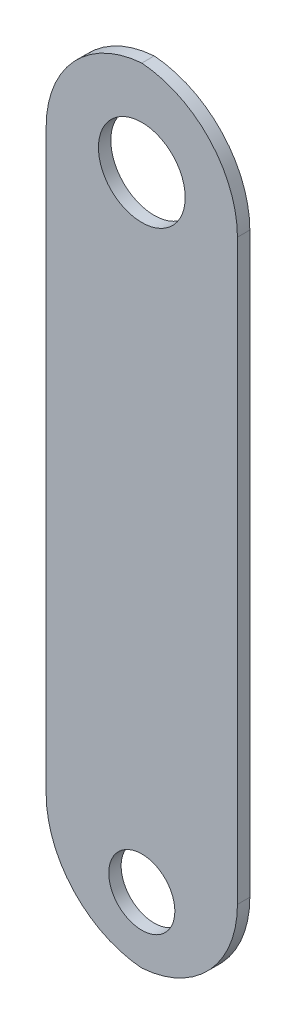
ISO-10303-21;
HEADER;
FILE_DESCRIPTION(('STEP AP214'),'2;1');
FILE_NAME('part.step','',(''),(''),'','','');
FILE_SCHEMA(('AUTOMOTIVE_DESIGN { 1 0 10303 214 1 1 1 1 }'));
ENDSEC;
DATA;
#1=APPLICATION_CONTEXT('core data for automotive mechanical design processes');
#2=APPLICATION_PROTOCOL_DEFINITION('international standard','automotive_design',2000,#1);
#3=PRODUCT_CONTEXT('',#1,'mechanical');
#4=PRODUCT('Part','Part','',(#3));
#5=PRODUCT_RELATED_PRODUCT_CATEGORY('part','',(#4));
#6=PRODUCT_DEFINITION_FORMATION('','',#4);
#7=PRODUCT_DEFINITION_CONTEXT('part definition',#1,'design');
#8=PRODUCT_DEFINITION('design','',#6,#7);
#9=PRODUCT_DEFINITION_SHAPE('','',#8);
#10=(LENGTH_UNIT() NAMED_UNIT(*) SI_UNIT(.MILLI.,.METRE.));
#11=(NAMED_UNIT(*) PLANE_ANGLE_UNIT() SI_UNIT($,.RADIAN.));
#12=(NAMED_UNIT(*) SI_UNIT($,.STERADIAN.) SOLID_ANGLE_UNIT());
#13=UNCERTAINTY_MEASURE_WITH_UNIT(LENGTH_MEASURE(1.E-05),#10,'distance_accuracy_value','');
#14=(GEOMETRIC_REPRESENTATION_CONTEXT(3) GLOBAL_UNCERTAINTY_ASSIGNED_CONTEXT((#13)) GLOBAL_UNIT_ASSIGNED_CONTEXT((#10,
#11,#12)) REPRESENTATION_CONTEXT('',''));
#15=CARTESIAN_POINT('',(0.,0.,0.));
#16=DIRECTION('',(0.,0.,1.));
#17=DIRECTION('',(1.,0.,0.));
#18=AXIS2_PLACEMENT_3D('',#15,#16,#17);
#19=CARTESIAN_POINT('',(0.,0.,3.));
#20=DIRECTION('',(0.,0.,1.));
#21=DIRECTION('',(1.,0.,0.));
#22=AXIS2_PLACEMENT_3D('',#19,#20,#21);
#23=PLANE('',#22);
#24=CARTESIAN_POINT('',(0.,71.93,3.));
#25=DIRECTION('',(0.,0.,1.));
#26=DIRECTION('',(1.,0.,0.));
#27=AXIS2_PLACEMENT_3D('',#24,#25,#26);
#28=CIRCLE('',#27,10.5);
#29=CARTESIAN_POINT('',(10.5,71.93,3.));
#30=VERTEX_POINT('',#29);
#31=EDGE_CURVE('E125',#30,#30,#28,.T.);
#32=ORIENTED_EDGE('',*,*,#31,.F.);
#33=EDGE_LOOP('',(#32));
#34=FACE_BOUND('',#33,.T.);
#35=CARTESIAN_POINT('',(1.85,-69.93,3.));
#36=DIRECTION('',(0.,0.,1.));
#37=DIRECTION('',(1.,0.,0.));
#38=AXIS2_PLACEMENT_3D('',#35,#36,#37);
#39=CIRCLE('',#38,25.);
#40=CARTESIAN_POINT('',(-23.15,-69.93,3.));
#41=VERTEX_POINT('',#40);
#42=CARTESIAN_POINT('',(0.,-94.8614560344958,3.));
#43=VERTEX_POINT('',#42);
#44=EDGE_CURVE('E58',#41,#43,#39,.T.);
#45=ORIENTED_EDGE('',*,*,#44,.T.);
#46=CARTESIAN_POINT('',(-1.85,-69.93,3.));
#47=DIRECTION('',(0.,0.,1.));
#48=DIRECTION('',(1.,0.,0.));
#49=AXIS2_PLACEMENT_3D('',#46,#47,#48);
#50=CIRCLE('',#49,25.);
#51=CARTESIAN_POINT('',(23.15,-69.93,3.));
#52=VERTEX_POINT('',#51);
#53=EDGE_CURVE('E138',#43,#52,#50,.T.);
#54=ORIENTED_EDGE('',*,*,#53,.T.);
#55=DIRECTION('',(0.,1.,0.));
#56=VECTOR('',#55,1.);
#57=CARTESIAN_POINT('',(23.15,-94.93,3.));
#58=LINE('',#57,#56);
#59=CARTESIAN_POINT('',(23.15,69.93,3.));
#60=VERTEX_POINT('',#59);
#61=EDGE_CURVE('E113',#52,#60,#58,.T.);
#62=ORIENTED_EDGE('',*,*,#61,.T.);
#63=CARTESIAN_POINT('',(-1.85000000000001,69.93,3.));
#64=DIRECTION('',(0.,0.,1.));
#65=DIRECTION('',(1.,0.,0.));
#66=AXIS2_PLACEMENT_3D('',#63,#64,#65);
#67=CIRCLE('',#66,25.);
#68=CARTESIAN_POINT('',(0.,94.8614560344959,3.));
#69=VERTEX_POINT('',#68);
#70=EDGE_CURVE('E65',#60,#69,#67,.T.);
#71=ORIENTED_EDGE('',*,*,#70,.T.);
#72=CARTESIAN_POINT('',(1.85,69.93,3.));
#73=DIRECTION('',(0.,0.,1.));
#74=DIRECTION('',(1.,0.,0.));
#75=AXIS2_PLACEMENT_3D('',#72,#73,#74);
#76=CIRCLE('',#75,25.);
#77=CARTESIAN_POINT('',(-23.15,69.93,3.));
#78=VERTEX_POINT('',#77);
#79=EDGE_CURVE('E135',#69,#78,#76,.T.);
#80=ORIENTED_EDGE('',*,*,#79,.T.);
#81=DIRECTION('',(0.,-1.,0.));
#82=VECTOR('',#81,1.);
#83=CARTESIAN_POINT('',(-23.15,-94.93,3.));
#84=LINE('',#83,#82);
#85=EDGE_CURVE('E120',#78,#41,#84,.T.);
#86=ORIENTED_EDGE('',*,*,#85,.T.);
#87=EDGE_LOOP('',(#45,#54,#62,#71,#80,#86));
#88=FACE_BOUND('',#87,.T.);
#89=CARTESIAN_POINT('',(0.,-78.93,3.));
#90=DIRECTION('',(0.,0.,1.));
#91=DIRECTION('',(1.,0.,0.));
#92=AXIS2_PLACEMENT_3D('',#89,#90,#91);
#93=CIRCLE('',#92,8.);
#94=CARTESIAN_POINT('',(8.00000000000001,-78.93,3.));
#95=VERTEX_POINT('',#94);
#96=EDGE_CURVE('E143',#95,#95,#93,.T.);
#97=ORIENTED_EDGE('',*,*,#96,.F.);
#98=EDGE_LOOP('',(#97));
#99=FACE_BOUND('',#98,.T.);
#100=ADVANCED_FACE('F41',(#34,#88,#99),#23,.T.);
#101=CARTESIAN_POINT('',(0.,0.,0.));
#102=DIRECTION('',(0.,0.,1.));
#103=DIRECTION('',(1.,0.,0.));
#104=AXIS2_PLACEMENT_3D('',#101,#102,#103);
#105=PLANE('',#104);
#106=DIRECTION('',(0.,1.,0.));
#107=VECTOR('',#106,1.);
#108=CARTESIAN_POINT('',(23.15,-94.93,0.));
#109=LINE('',#108,#107);
#110=CARTESIAN_POINT('',(23.15,-69.93,0.));
#111=VERTEX_POINT('',#110);
#112=CARTESIAN_POINT('',(23.15,69.93,0.));
#113=VERTEX_POINT('',#112);
#114=EDGE_CURVE('E111',#111,#113,#109,.T.);
#115=ORIENTED_EDGE('',*,*,#114,.F.);
#116=CARTESIAN_POINT('',(-1.85,-69.93,0.));
#117=DIRECTION('',(0.,0.,1.));
#118=DIRECTION('',(1.,0.,0.));
#119=AXIS2_PLACEMENT_3D('',#116,#117,#118);
#120=CIRCLE('',#119,25.);
#121=CARTESIAN_POINT('',(0.,-94.8614560344958,0.));
#122=VERTEX_POINT('',#121);
#123=EDGE_CURVE('E96',#111,#122,#120,.F.);
#124=ORIENTED_EDGE('',*,*,#123,.T.);
#125=CARTESIAN_POINT('',(1.85,-69.93,0.));
#126=DIRECTION('',(0.,0.,1.));
#127=DIRECTION('',(1.,0.,0.));
#128=AXIS2_PLACEMENT_3D('',#125,#126,#127);
#129=CIRCLE('',#128,25.);
#130=CARTESIAN_POINT('',(-23.15,-69.93,0.));
#131=VERTEX_POINT('',#130);
#132=EDGE_CURVE('E105',#122,#131,#129,.F.);
#133=ORIENTED_EDGE('',*,*,#132,.T.);
#134=DIRECTION('',(0.,-1.,0.));
#135=VECTOR('',#134,1.);
#136=CARTESIAN_POINT('',(-23.15,-94.93,0.));
#137=LINE('',#136,#135);
#138=CARTESIAN_POINT('',(-23.15,69.93,0.));
#139=VERTEX_POINT('',#138);
#140=EDGE_CURVE('E121',#139,#131,#137,.T.);
#141=ORIENTED_EDGE('',*,*,#140,.F.);
#142=CARTESIAN_POINT('',(1.85,69.93,0.));
#143=DIRECTION('',(0.,0.,1.));
#144=DIRECTION('',(1.,0.,0.));
#145=AXIS2_PLACEMENT_3D('',#142,#143,#144);
#146=CIRCLE('',#145,25.);
#147=CARTESIAN_POINT('',(0.,94.8614560344959,0.));
#148=VERTEX_POINT('',#147);
#149=EDGE_CURVE('E131',#139,#148,#146,.F.);
#150=ORIENTED_EDGE('',*,*,#149,.T.);
#151=CARTESIAN_POINT('',(-1.85000000000001,69.93,0.));
#152=DIRECTION('',(0.,0.,1.));
#153=DIRECTION('',(1.,0.,0.));
#154=AXIS2_PLACEMENT_3D('',#151,#152,#153);
#155=CIRCLE('',#154,25.);
#156=EDGE_CURVE('E114',#148,#113,#155,.F.);
#157=ORIENTED_EDGE('',*,*,#156,.T.);
#158=EDGE_LOOP('',(#115,#124,#133,#141,#150,#157));
#159=FACE_BOUND('',#158,.T.);
#160=CARTESIAN_POINT('',(0.,71.93,0.));
#161=DIRECTION('',(0.,0.,1.));
#162=DIRECTION('',(1.,0.,0.));
#163=AXIS2_PLACEMENT_3D('',#160,#161,#162);
#164=CIRCLE('',#163,10.5);
#165=CARTESIAN_POINT('',(10.5,71.93,0.));
#166=VERTEX_POINT('',#165);
#167=EDGE_CURVE('E153',#166,#166,#164,.T.);
#168=ORIENTED_EDGE('',*,*,#167,.T.);
#169=EDGE_LOOP('',(#168));
#170=FACE_BOUND('',#169,.T.);
#171=CARTESIAN_POINT('',(0.,-78.93,0.));
#172=DIRECTION('',(0.,0.,1.));
#173=DIRECTION('',(1.,0.,0.));
#174=AXIS2_PLACEMENT_3D('',#171,#172,#173);
#175=CIRCLE('',#174,8.);
#176=CARTESIAN_POINT('',(8.00000000000001,-78.93,0.));
#177=VERTEX_POINT('',#176);
#178=EDGE_CURVE('E141',#177,#177,#175,.T.);
#179=ORIENTED_EDGE('',*,*,#178,.T.);
#180=EDGE_LOOP('',(#179));
#181=FACE_BOUND('',#180,.T.);
#182=ADVANCED_FACE('F117',(#159,#170,#181),#105,.F.);
#183=CARTESIAN_POINT('',(-23.15,-94.93,3.));
#184=DIRECTION('',(1.,0.,0.));
#185=DIRECTION('',(0.,0.,-1.));
#186=AXIS2_PLACEMENT_3D('',#183,#184,#185);
#187=PLANE('',#186);
#188=ORIENTED_EDGE('',*,*,#140,.T.);
#189=DIRECTION('',(0.,0.,-1.));
#190=VECTOR('',#189,1.);
#191=CARTESIAN_POINT('',(-23.15,-69.93,3.));
#192=LINE('',#191,#190);
#193=EDGE_CURVE('E11',#131,#41,#192,.F.);
#194=ORIENTED_EDGE('',*,*,#193,.T.);
#195=ORIENTED_EDGE('',*,*,#85,.F.);
#196=DIRECTION('',(0.,0.,-1.));
#197=VECTOR('',#196,1.);
#198=CARTESIAN_POINT('',(-23.15,69.93,3.));
#199=LINE('',#198,#197);
#200=EDGE_CURVE('E50',#78,#139,#199,.T.);
#201=ORIENTED_EDGE('',*,*,#200,.T.);
#202=EDGE_LOOP('',(#188,#194,#195,#201));
#203=FACE_BOUND('',#202,.T.);
#204=ADVANCED_FACE('F169',(#203),#187,.F.);
#205=CARTESIAN_POINT('',(23.15,-94.93,3.));
#206=DIRECTION('',(-1.,0.,0.));
#207=DIRECTION('',(0.,-1.,0.));
#208=AXIS2_PLACEMENT_3D('',#205,#206,#207);
#209=PLANE('',#208);
#210=ORIENTED_EDGE('',*,*,#61,.F.);
#211=DIRECTION('',(0.,0.,-1.));
#212=VECTOR('',#211,1.);
#213=CARTESIAN_POINT('',(23.15,-69.93,3.));
#214=LINE('',#213,#212);
#215=EDGE_CURVE('E100',#52,#111,#214,.T.);
#216=ORIENTED_EDGE('',*,*,#215,.T.);
#217=ORIENTED_EDGE('',*,*,#114,.T.);
#218=DIRECTION('',(0.,0.,-1.));
#219=VECTOR('',#218,1.);
#220=CARTESIAN_POINT('',(23.15,69.93,3.));
#221=LINE('',#220,#219);
#222=EDGE_CURVE('E115',#113,#60,#221,.F.);
#223=ORIENTED_EDGE('',*,*,#222,.T.);
#224=EDGE_LOOP('',(#210,#216,#217,#223));
#225=FACE_BOUND('',#224,.T.);
#226=ADVANCED_FACE('F110',(#225),#209,.F.);
#227=CARTESIAN_POINT('',(0.,71.93,3.));
#228=DIRECTION('',(0.,0.,-1.));
#229=DIRECTION('',(-1.,0.,0.));
#230=AXIS2_PLACEMENT_3D('',#227,#228,#229);
#231=CYLINDRICAL_SURFACE('',#230,10.5);
#232=ORIENTED_EDGE('',*,*,#31,.T.);
#233=EDGE_LOOP('',(#232));
#234=FACE_BOUND('',#233,.T.);
#235=ORIENTED_EDGE('',*,*,#167,.F.);
#236=EDGE_LOOP('',(#235));
#237=FACE_BOUND('',#236,.T.);
#238=ADVANCED_FACE('F173',(#234,#237),#231,.F.);
#239=CARTESIAN_POINT('',(0.,-78.93,3.));
#240=DIRECTION('',(0.,0.,-1.));
#241=DIRECTION('',(-1.,0.,0.));
#242=AXIS2_PLACEMENT_3D('',#239,#240,#241);
#243=CYLINDRICAL_SURFACE('',#242,8.);
#244=ORIENTED_EDGE('',*,*,#96,.T.);
#245=EDGE_LOOP('',(#244));
#246=FACE_BOUND('',#245,.T.);
#247=ORIENTED_EDGE('',*,*,#178,.F.);
#248=EDGE_LOOP('',(#247));
#249=FACE_BOUND('',#248,.T.);
#250=ADVANCED_FACE('F161',(#246,#249),#243,.F.);
#251=CARTESIAN_POINT('',(1.85,-69.93,3.));
#252=DIRECTION('',(0.,0.,-1.));
#253=DIRECTION('',(-1.,0.,0.));
#254=AXIS2_PLACEMENT_3D('',#251,#252,#253);
#255=CYLINDRICAL_SURFACE('',#254,25.);
#256=DIRECTION('',(0.,0.,-1.));
#257=VECTOR('',#256,1.);
#258=CARTESIAN_POINT('',(0.,-94.8614560344959,1.5));
#259=LINE('',#258,#257);
#260=EDGE_CURVE('E101',#43,#122,#259,.T.);
#261=ORIENTED_EDGE('',*,*,#260,.F.);
#262=ORIENTED_EDGE('',*,*,#44,.F.);
#263=ORIENTED_EDGE('',*,*,#193,.F.);
#264=ORIENTED_EDGE('',*,*,#132,.F.);
#265=EDGE_LOOP('',(#261,#262,#263,#264));
#266=FACE_BOUND('',#265,.T.);
#267=ADVANCED_FACE('F183',(#266),#255,.T.);
#268=CARTESIAN_POINT('',(-1.85,-69.93,3.));
#269=DIRECTION('',(0.,0.,-1.));
#270=DIRECTION('',(-1.,0.,0.));
#271=AXIS2_PLACEMENT_3D('',#268,#269,#270);
#272=CYLINDRICAL_SURFACE('',#271,25.);
#273=ORIENTED_EDGE('',*,*,#53,.F.);
#274=ORIENTED_EDGE('',*,*,#260,.T.);
#275=ORIENTED_EDGE('',*,*,#123,.F.);
#276=ORIENTED_EDGE('',*,*,#215,.F.);
#277=EDGE_LOOP('',(#273,#274,#275,#276));
#278=FACE_BOUND('',#277,.T.);
#279=ADVANCED_FACE('F99',(#278),#272,.T.);
#280=CARTESIAN_POINT('',(-1.85000000000001,69.93,3.));
#281=DIRECTION('',(0.,0.,-1.));
#282=DIRECTION('',(-1.,0.,0.));
#283=AXIS2_PLACEMENT_3D('',#280,#281,#282);
#284=CYLINDRICAL_SURFACE('',#283,25.);
#285=DIRECTION('',(0.,0.,-1.));
#286=VECTOR('',#285,1.);
#287=CARTESIAN_POINT('',(0.,94.8614560344959,1.5));
#288=LINE('',#287,#286);
#289=EDGE_CURVE('E45',#69,#148,#288,.T.);
#290=ORIENTED_EDGE('',*,*,#289,.F.);
#291=ORIENTED_EDGE('',*,*,#70,.F.);
#292=ORIENTED_EDGE('',*,*,#222,.F.);
#293=ORIENTED_EDGE('',*,*,#156,.F.);
#294=EDGE_LOOP('',(#290,#291,#292,#293));
#295=FACE_BOUND('',#294,.T.);
#296=ADVANCED_FACE('F43',(#295),#284,.T.);
#297=CARTESIAN_POINT('',(1.85,69.93,3.));
#298=DIRECTION('',(0.,0.,-1.));
#299=DIRECTION('',(-1.,0.,0.));
#300=AXIS2_PLACEMENT_3D('',#297,#298,#299);
#301=CYLINDRICAL_SURFACE('',#300,25.);
#302=ORIENTED_EDGE('',*,*,#79,.F.);
#303=ORIENTED_EDGE('',*,*,#289,.T.);
#304=ORIENTED_EDGE('',*,*,#149,.F.);
#305=ORIENTED_EDGE('',*,*,#200,.F.);
#306=EDGE_LOOP('',(#302,#303,#304,#305));
#307=FACE_BOUND('',#306,.T.);
#308=ADVANCED_FACE('F148',(#307),#301,.T.);
#309=CLOSED_SHELL('',(#100,#182,#204,#226,#238,#250,#267,#279,#296,#308));
#310=MANIFOLD_SOLID_BREP('B2',#309);
#311=ADVANCED_BREP_SHAPE_REPRESENTATION('',(#18,#310),#14);
#312=SHAPE_DEFINITION_REPRESENTATION(#9,#311);
ENDSEC;
END-ISO-10303-21;
